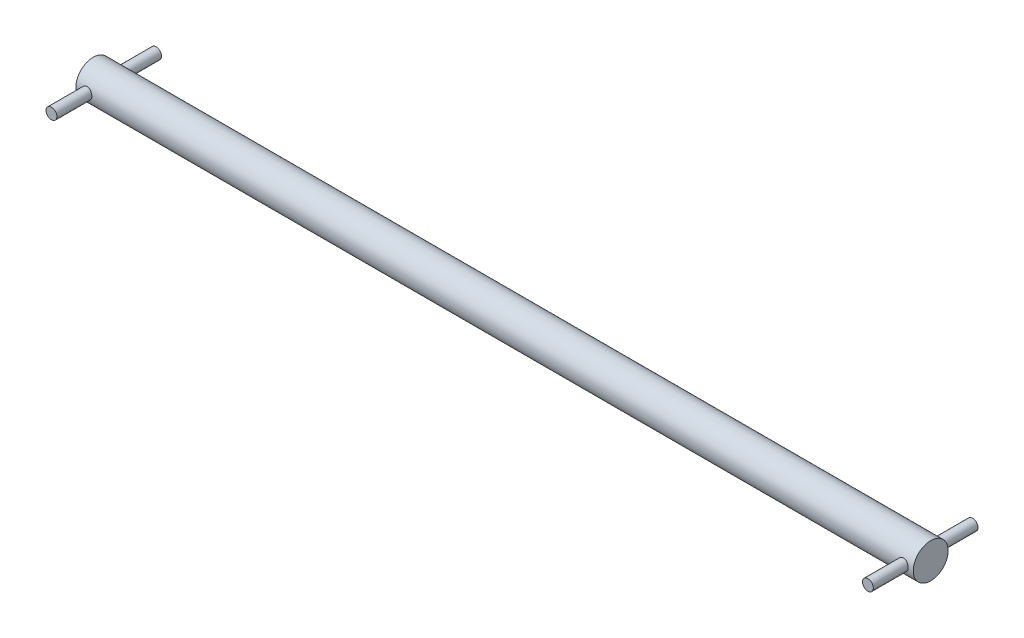
ISO-10303-21;
HEADER;
FILE_DESCRIPTION(('STEP AP214'),'2;1');
FILE_NAME('part.step','',(''),(''),'','','');
FILE_SCHEMA(('AUTOMOTIVE_DESIGN { 1 0 10303 214 1 1 1 1 }'));
ENDSEC;
DATA;
#1=APPLICATION_CONTEXT('core data for automotive mechanical design processes');
#2=APPLICATION_PROTOCOL_DEFINITION('international standard','automotive_design',2000,#1);
#3=PRODUCT_CONTEXT('',#1,'mechanical');
#4=PRODUCT('Part','Part','',(#3));
#5=PRODUCT_RELATED_PRODUCT_CATEGORY('part','',(#4));
#6=PRODUCT_DEFINITION_FORMATION('','',#4);
#7=PRODUCT_DEFINITION_CONTEXT('part definition',#1,'design');
#8=PRODUCT_DEFINITION('design','',#6,#7);
#9=PRODUCT_DEFINITION_SHAPE('','',#8);
#10=(LENGTH_UNIT() NAMED_UNIT(*) SI_UNIT(.MILLI.,.METRE.));
#11=(NAMED_UNIT(*) PLANE_ANGLE_UNIT() SI_UNIT($,.RADIAN.));
#12=(NAMED_UNIT(*) SI_UNIT($,.STERADIAN.) SOLID_ANGLE_UNIT());
#13=UNCERTAINTY_MEASURE_WITH_UNIT(LENGTH_MEASURE(1.E-05),#10,'distance_accuracy_value','');
#14=(GEOMETRIC_REPRESENTATION_CONTEXT(3) GLOBAL_UNCERTAINTY_ASSIGNED_CONTEXT((#13)) GLOBAL_UNIT_ASSIGNED_CONTEXT((#10,
#11,#12)) REPRESENTATION_CONTEXT('',''));
#15=CARTESIAN_POINT('',(0.,0.,0.));
#16=DIRECTION('',(0.,0.,1.));
#17=DIRECTION('',(1.,0.,0.));
#18=AXIS2_PLACEMENT_3D('',#15,#16,#17);
#19=CARTESIAN_POINT('',(609.6,0.,0.));
#20=DIRECTION('',(-1.,0.,0.));
#21=DIRECTION('',(0.,0.,1.));
#22=AXIS2_PLACEMENT_3D('',#19,#20,#21);
#23=CYLINDRICAL_SURFACE('',#22,12.7);
#24=CARTESIAN_POINT('',(598.01125,-5.19723153402651E-12,-12.7));
#25=CARTESIAN_POINT('',(598.011251417916,0.217294412923974,-12.6999989166263));
#26=CARTESIAN_POINT('',(598.029154545549,0.434603691691359,-12.6943705657689));
#27=CARTESIAN_POINT('',(598.100106316887,0.862867240438078,-12.67246938732));
#28=CARTESIAN_POINT('',(598.153162915832,1.07382006064949,-12.656194150346));
#29=CARTESIAN_POINT('',(598.292457753547,1.48313312608605,-12.6147771484092));
#30=CARTESIAN_POINT('',(598.378644631773,1.68151231192468,-12.5896491125947));
#31=CARTESIAN_POINT('',(598.581534983629,2.06100299744478,-12.5331210208656));
#32=CARTESIAN_POINT('',(598.698243265903,2.24211177003228,-12.501719976823));
#33=CARTESIAN_POINT('',(598.962657774655,2.58751493846823,-12.4348942862549));
#34=CARTESIAN_POINT('',(599.111136310069,2.7512010893921,-12.3993819806826));
#35=CARTESIAN_POINT('',(599.433232145913,3.05180168796217,-12.3288439723829));
#36=CARTESIAN_POINT('',(599.606854116045,3.18871115144812,-12.2938183613728));
#37=CARTESIAN_POINT('',(599.97957399009,3.43517018333352,-12.2272788441668));
#38=CARTESIAN_POINT('',(600.179195491149,3.5439598967611,-12.1958731285772));
#39=CARTESIAN_POINT('',(600.595040600067,3.72617177917924,-12.1414477071336));
#40=CARTESIAN_POINT('',(600.811259817144,3.79960326475471,-12.1184257926112));
#41=CARTESIAN_POINT('',(601.247299145911,3.90678860277264,-12.0842915217366));
#42=CARTESIAN_POINT('',(601.466814728558,3.94167074274191,-12.072841390429));
#43=CARTESIAN_POINT('',(601.90885815254,3.97429212242176,-12.0621442508114));
#44=CARTESIAN_POINT('',(602.131385177339,3.9720412366202,-12.0628939982847));
#45=CARTESIAN_POINT('',(602.56380141138,3.93134293524929,-12.0762137528444));
#46=CARTESIAN_POINT('',(602.773842474694,3.89432983731101,-12.0883153493276));
#47=CARTESIAN_POINT('',(603.184570097085,3.78748332400018,-12.1222143133619));
#48=CARTESIAN_POINT('',(603.385255659494,3.71764642055133,-12.1440127113465));
#49=CARTESIAN_POINT('',(603.774992423548,3.54612177113649,-12.1952081477578));
#50=CARTESIAN_POINT('',(603.96383083894,3.44398363976886,-12.2247115380638));
#51=CARTESIAN_POINT('',(604.322158663023,3.21106865841844,-12.2879439463374));
#52=CARTESIAN_POINT('',(604.491643028058,3.08028436905403,-12.3216740610061));
#53=CARTESIAN_POINT('',(604.814560445347,2.78675132952386,-12.39143850769));
#54=CARTESIAN_POINT('',(604.96691159595,2.62281851162716,-12.4275078349882));
#55=CARTESIAN_POINT('',(605.242223262116,2.27128199569779,-12.4965323716114));
#56=CARTESIAN_POINT('',(605.365181600271,2.08367654557779,-12.5294873501175));
#57=CARTESIAN_POINT('',(605.578950411309,1.68803513822257,-12.588916112766));
#58=CARTESIAN_POINT('',(605.669502830098,1.4798513294634,-12.6153373755817));
#59=CARTESIAN_POINT('',(605.813980777704,1.05018832945456,-12.6583425975566));
#60=CARTESIAN_POINT('',(605.867917428107,0.828713197545349,-12.6749295435738));
#61=CARTESIAN_POINT('',(605.935789785188,0.387937874391623,-12.6959166132919));
#62=CARTESIAN_POINT('',(605.951190125909,0.168884119899368,-12.7007627269302));
#63=CARTESIAN_POINT('',(605.945682230426,-0.268701220706124,-12.6990411414586));
#64=CARTESIAN_POINT('',(605.924779298251,-0.487232878428299,-12.6924751097008));
#65=CARTESIAN_POINT('',(605.848433993475,-0.91192138220343,-12.6689600496896));
#66=CARTESIAN_POINT('',(605.79386312533,-1.11825080649159,-12.6522731812639));
#67=CARTESIAN_POINT('',(605.652794431236,-1.51876737413998,-12.6104688537918));
#68=CARTESIAN_POINT('',(605.566292662221,-1.71295301443085,-12.5853503535797));
#69=CARTESIAN_POINT('',(605.361460037458,-2.0889353911893,-12.5285037326109));
#70=CARTESIAN_POINT('',(605.242404614698,-2.27031467383136,-12.49662940146));
#71=CARTESIAN_POINT('',(604.976713557877,-2.61101157680398,-12.4299157676078));
#72=CARTESIAN_POINT('',(604.830070443661,-2.77032319329469,-12.3950756621693));
#73=CARTESIAN_POINT('',(604.506478024085,-3.06891519477306,-12.3246195875385));
#74=CARTESIAN_POINT('',(604.328558092628,-3.20715171178531,-12.2890275779282));
#75=CARTESIAN_POINT('',(603.951272993004,-3.45189969528877,-12.222541820284));
#76=CARTESIAN_POINT('',(603.751908165514,-3.55841166566161,-12.1916479976326));
#77=CARTESIAN_POINT('',(603.337804076136,-3.73602515051243,-12.1383990890035));
#78=CARTESIAN_POINT('',(603.123128113042,-3.80726377090861,-12.1160110218291));
#79=CARTESIAN_POINT('',(602.683984833935,-3.91232689460458,-12.0824996743052));
#80=CARTESIAN_POINT('',(602.459521277609,-3.94616563489954,-12.0713721075623));
#81=CARTESIAN_POINT('',(602.018087021932,-3.9744461455257,-12.0620882936639));
#82=CARTESIAN_POINT('',(601.801236534034,-3.97060037799214,-12.0633681960528));
#83=CARTESIAN_POINT('',(601.371433192809,-3.92775497559569,-12.0773853694332));
#84=CARTESIAN_POINT('',(601.158480158135,-3.88875698061999,-12.0901221059517));
#85=CARTESIAN_POINT('',(600.745578924296,-3.77786042476261,-12.125223850321));
#86=CARTESIAN_POINT('',(600.545485974529,-3.70645189639602,-12.147445167539));
#87=CARTESIAN_POINT('',(600.15996168703,-3.53314721789152,-12.1989756100809));
#88=CARTESIAN_POINT('',(599.974533341401,-3.43124486610984,-12.2282861769393));
#89=CARTESIAN_POINT('',(599.615749043854,-3.19518268168379,-12.2921232133123));
#90=CARTESIAN_POINT('',(599.443149188837,-3.05991683939661,-12.3268088783025));
#91=CARTESIAN_POINT('',(599.122543408245,-2.76291356359071,-12.3967557125722));
#92=CARTESIAN_POINT('',(598.974544082454,-2.60116904944893,-12.4320170335101));
#93=CARTESIAN_POINT('',(598.702502940698,-2.24944515446967,-12.50052338449));
#94=CARTESIAN_POINT('',(598.579401211772,-2.05871627400301,-12.5336649799479));
#95=CARTESIAN_POINT('',(598.367170944432,-1.65823626319892,-12.5928999251751));
#96=CARTESIAN_POINT('',(598.2780290507,-1.44849265100611,-12.6189960445267));
#97=CARTESIAN_POINT('',(598.142722407843,-1.03424874231788,-12.6593806607872));
#98=CARTESIAN_POINT('',(598.093562296306,-0.830803320337787,-12.6744806455946));
#99=CARTESIAN_POINT('',(598.027828707102,-0.418242418028124,-12.6947898358102));
#100=CARTESIAN_POINT('',(598.011248635372,-0.209128093748738,-12.7000010426586));
#101=CARTESIAN_POINT('',(598.01125,-5.19723153402651E-12,-12.7));
#102=B_SPLINE_CURVE_WITH_KNOTS('',3,(#24,#25,#26,#27,#28,#29,#30,#31,#32,#33,#34,#35,#36,#37,
#38,#39,#40,#41,#42,#43,#44,#45,#46,#47,#48,#49,#50,#51,#52,#53,#54,#55,#56,#57,#58,#59,#60,#61,
#62,#63,#64,#65,#66,#67,#68,#69,#70,#71,#72,#73,#74,#75,#76,#77,#78,#79,#80,#81,#82,#83,#84,#85,
#86,#87,#88,#89,#90,#91,#92,#93,#94,#95,#96,#97,#98,#99,#100,#101),.UNSPECIFIED.,.T.,.F.,(4,2,2,
2,2,2,2,2,2,2,2,2,2,2,2,2,2,2,2,2,2,2,2,2,2,2,2,2,2,2,2,2,2,2,2,2,2,2,4),(0.,0.651114551948165,
1.3023765016332,1.95263287146765,2.60299175094775,3.27145085469602,3.94003426594265,
4.6251422371075,5.3100695893746,5.97437051780854,6.63849479687025,7.27636712817865,
7.91430725938272,8.56156665642483,9.20899434587629,9.88589422617475,10.5628442354198,
11.2450708769476,11.9270902077494,12.5827653014538,13.2383446069144,13.8776273984984,
14.5169891598925,15.1719383104896,15.8270653013163,16.5081514741896,17.1892268287804,
17.8676336752166,18.545782183788,19.1932624606431,19.8407125334475,20.4786837506947,
21.1167848028334,21.7798495700523,22.4430919369538,23.1279912133639,23.8126208620066,
24.439392214037,25.0660366970775),.UNSPECIFIED.);
#103=CARTESIAN_POINT('',(598.01125,-5.19723153402651E-12,-12.7));
#104=VERTEX_POINT('',#103);
#105=EDGE_CURVE('E43',#104,#104,#102,.T.);
#106=ORIENTED_EDGE('',*,*,#105,.F.);
#107=EDGE_LOOP('',(#106));
#108=FACE_BOUND('',#107,.T.);
#109=CARTESIAN_POINT('',(3.65125,0.,-12.7));
#110=CARTESIAN_POINT('',(3.65125141791555,0.217294412929186,-12.6999989166262));
#111=CARTESIAN_POINT('',(3.66915454554863,0.43460369169658,-12.6943705657687));
#112=CARTESIAN_POINT('',(3.74010631688707,0.862867240443327,-12.6724693873196));
#113=CARTESIAN_POINT('',(3.79316291583183,1.07382006065476,-12.6561941503455));
#114=CARTESIAN_POINT('',(3.93245775354646,1.48313312609132,-12.6147771484086));
#115=CARTESIAN_POINT('',(4.01864463177317,1.68151231192993,-12.589649112594));
#116=CARTESIAN_POINT('',(4.22153498362869,2.06100299745002,-12.5331210208647));
#117=CARTESIAN_POINT('',(4.33824326590336,2.24211177003752,-12.5017199768221));
#118=CARTESIAN_POINT('',(4.60265777465513,2.5875149384735,-12.4348942862538));
#119=CARTESIAN_POINT('',(4.75113631006893,2.75120108939739,-12.3993819806815));
#120=CARTESIAN_POINT('',(5.073232145913,3.05180168796748,-12.3288439723816));
#121=CARTESIAN_POINT('',(5.24685411604509,3.18871115145342,-12.2938183613714));
#122=CARTESIAN_POINT('',(5.61957399009077,3.43517018333881,-12.2272788441653));
#123=CARTESIAN_POINT('',(5.81919549114932,3.5439598967664,-12.1958731285757));
#124=CARTESIAN_POINT('',(6.23504060006707,3.72617177918452,-12.141447707132));
#125=CARTESIAN_POINT('',(6.4512598171443,3.79960326475997,-12.1184257926096));
#126=CARTESIAN_POINT('',(6.88729914591169,3.90678860277786,-12.0842915217349));
#127=CARTESIAN_POINT('',(7.10681472855847,3.94167074274713,-12.0728413904273));
#128=CARTESIAN_POINT('',(7.54885815254015,3.97429212242696,-12.0621442508097));
#129=CARTESIAN_POINT('',(7.77138517733972,3.97204123662538,-12.062893998283));
#130=CARTESIAN_POINT('',(8.20380141138065,3.93134293525445,-12.0762137528427));
#131=CARTESIAN_POINT('',(8.41384247469401,3.89432983731616,-12.0883153493259));
#132=CARTESIAN_POINT('',(8.8245700970855,3.78748332400533,-12.1222143133603));
#133=CARTESIAN_POINT('',(9.02525565949387,3.7176464205565,-12.144012711345));
#134=CARTESIAN_POINT('',(9.414992423548,3.5461217711417,-12.1952081477563));
#135=CARTESIAN_POINT('',(9.60383083894017,3.44398363977409,-12.2247115380623));
#136=CARTESIAN_POINT('',(9.96215866302309,3.21106865842369,-12.287943946336));
#137=CARTESIAN_POINT('',(10.1316430280574,3.08028436905927,-12.3216740610048));
#138=CARTESIAN_POINT('',(10.454560445347,2.7867513295291,-12.3914385076889));
#139=CARTESIAN_POINT('',(10.60691159595,2.62281851163243,-12.4275078349871));
#140=CARTESIAN_POINT('',(10.882223262116,2.27128199570308,-12.4965323716105));
#141=CARTESIAN_POINT('',(11.0051816002711,2.08367654558308,-12.5294873501166));
#142=CARTESIAN_POINT('',(11.2189504113089,1.68803513822788,-12.5889161127653));
#143=CARTESIAN_POINT('',(11.3095028300981,1.47985132946873,-12.615337375581));
#144=CARTESIAN_POINT('',(11.4539807777038,1.05018832945987,-12.6583425975561));
#145=CARTESIAN_POINT('',(11.5079174281069,0.828713197550621,-12.6749295435735));
#146=CARTESIAN_POINT('',(11.5757897851883,0.387937874396843,-12.6959166132918));
#147=CARTESIAN_POINT('',(11.5911901259094,0.168884119904572,-12.7007627269301));
#148=CARTESIAN_POINT('',(11.5856822304265,-0.268701220700966,-12.6990411414587));
#149=CARTESIAN_POINT('',(11.5647792982507,-0.48723287842317,-12.692475109701));
#150=CARTESIAN_POINT('',(11.4884339934747,-0.911921382198323,-12.6689600496899));
#151=CARTESIAN_POINT('',(11.4338631253304,-1.11825080648648,-12.6522731812643));
#152=CARTESIAN_POINT('',(11.2927944312357,-1.51876737413487,-12.6104688537924));
#153=CARTESIAN_POINT('',(11.2062926622206,-1.71295301442576,-12.5853503535804));
#154=CARTESIAN_POINT('',(11.0014600374579,-2.0889353911842,-12.5285037326117));
#155=CARTESIAN_POINT('',(10.8824046146976,-2.27031467382624,-12.4966294014609));
#156=CARTESIAN_POINT('',(10.6167135578772,-2.61101157679882,-12.4299157676089));
#157=CARTESIAN_POINT('',(10.4700704436608,-2.77032319328954,-12.3950756621704));
#158=CARTESIAN_POINT('',(10.1464780240846,-3.06891519476788,-12.3246195875397));
#159=CARTESIAN_POINT('',(9.96855809262797,-3.20715171178012,-12.2890275779295));
#160=CARTESIAN_POINT('',(9.59127299300375,-3.45189969528356,-12.2225418202855));
#161=CARTESIAN_POINT('',(9.39190816551433,-3.55841166565639,-12.1916479976341));
#162=CARTESIAN_POINT('',(8.97780407613624,-3.73602515050722,-12.1383990890051));
#163=CARTESIAN_POINT('',(8.76312811304158,-3.8072637709034,-12.1160110218308));
#164=CARTESIAN_POINT('',(8.32398483393563,-3.91232689459937,-12.0824996743068));
#165=CARTESIAN_POINT('',(8.09952127760928,-3.94616563489433,-12.071372107564));
#166=CARTESIAN_POINT('',(7.65808702193213,-3.97444614552049,-12.0620882936656));
#167=CARTESIAN_POINT('',(7.44123653403444,-3.97060037798694,-12.0633681960545));
#168=CARTESIAN_POINT('',(7.01143319280933,-3.92775497559048,-12.0773853694349));
#169=CARTESIAN_POINT('',(6.7984801581346,-3.88875698061476,-12.0901221059534));
#170=CARTESIAN_POINT('',(6.38557892429573,-3.77786042475736,-12.1252238503226));
#171=CARTESIAN_POINT('',(6.18548597452857,-3.70645189639076,-12.1474451675407));
#172=CARTESIAN_POINT('',(5.79996168702952,-3.53314721788623,-12.1989756100824));
#173=CARTESIAN_POINT('',(5.61453334140106,-3.43124486610452,-12.2282861769408));
#174=CARTESIAN_POINT('',(5.25574904385359,-3.19518268167841,-12.2921232133137));
#175=CARTESIAN_POINT('',(5.08314918883673,-3.0599168393912,-12.3268088783039));
#176=CARTESIAN_POINT('',(4.7625434082444,-2.76291356358524,-12.3967557125734));
#177=CARTESIAN_POINT('',(4.61454408245338,-2.60116904944344,-12.4320170335113));
#178=CARTESIAN_POINT('',(4.34250294069769,-2.24944515446413,-12.500523384491));
#179=CARTESIAN_POINT('',(4.2194012117714,-2.05871627399745,-12.5336649799489));
#180=CARTESIAN_POINT('',(4.00717094443223,-1.65823626319335,-12.5928999251759));
#181=CARTESIAN_POINT('',(3.91802905069967,-1.44849265100056,-12.6189960445273));
#182=CARTESIAN_POINT('',(3.78272240784313,-1.03424874231239,-12.6593806607877));
#183=CARTESIAN_POINT('',(3.73356229630555,-0.830803320332339,-12.674480645595));
#184=CARTESIAN_POINT('',(3.6678287071025,-0.418242418022788,-12.6947898358104));
#185=CARTESIAN_POINT('',(3.65124863537229,-0.209128093743468,-12.7000010426587));
#186=CARTESIAN_POINT('',(3.65125,0.,-12.7));
#187=B_SPLINE_CURVE_WITH_KNOTS('',3,(#109,#110,#111,#112,#113,#114,#115,#116,#117,#118,#119,
#120,#121,#122,#123,#124,#125,#126,#127,#128,#129,#130,#131,#132,#133,#134,#135,#136,#137,#138,
#139,#140,#141,#142,#143,#144,#145,#146,#147,#148,#149,#150,#151,#152,#153,#154,#155,#156,#157,
#158,#159,#160,#161,#162,#163,#164,#165,#166,#167,#168,#169,#170,#171,#172,#173,#174,#175,#176,
#177,#178,#179,#180,#181,#182,#183,#184,#185,#186),.UNSPECIFIED.,.T.,.F.,(4,2,2,2,2,2,2,2,2,2,2,
2,2,2,2,2,2,2,2,2,2,2,2,2,2,2,2,2,2,2,2,2,2,2,2,2,2,2,4),(0.,0.651114551948222,1.30237650163329,
1.95263287146774,2.6029917509479,3.27145085469629,3.94003426594303,4.62514223710794,
5.31006958937499,5.97437051780892,6.63849479687064,7.27636712817897,7.91430725938283,
8.56156665642489,9.20899434587646,9.88589422617489,10.56284423542,11.2450708769478,
11.9270902077497,12.5827653014541,13.2383446069149,13.8776273984988,14.516989159893,
15.17193831049,15.8270653013166,16.5081514741898,17.1892268287805,17.8676336752166,
18.5457821837881,19.1932624606433,19.8407125334477,20.4786837506951,21.1167848028338,
21.7798495700527,22.4430919369543,23.1279912133643,23.8126208620069,24.4393922140372,
25.0660366970775),.UNSPECIFIED.);
#188=CARTESIAN_POINT('',(3.65125,0.,-12.7));
#189=VERTEX_POINT('',#188);
#190=EDGE_CURVE('E51',#189,#189,#187,.T.);
#191=ORIENTED_EDGE('',*,*,#190,.F.);
#192=EDGE_LOOP('',(#191));
#193=FACE_BOUND('',#192,.T.);
#194=CARTESIAN_POINT('',(609.6,0.,0.));
#195=DIRECTION('',(1.,0.,0.));
#196=DIRECTION('',(0.,0.,-1.));
#197=AXIS2_PLACEMENT_3D('',#194,#195,#196);
#198=CIRCLE('',#197,12.7);
#199=CARTESIAN_POINT('',(609.6,0.,-12.7));
#200=VERTEX_POINT('',#199);
#201=EDGE_CURVE('E90',#200,#200,#198,.T.);
#202=ORIENTED_EDGE('',*,*,#201,.F.);
#203=EDGE_LOOP('',(#202));
#204=FACE_BOUND('',#203,.T.);
#205=CARTESIAN_POINT('',(0.,0.,0.));
#206=DIRECTION('',(1.,0.,0.));
#207=DIRECTION('',(0.,0.,-1.));
#208=AXIS2_PLACEMENT_3D('',#205,#206,#207);
#209=CIRCLE('',#208,12.7);
#210=CARTESIAN_POINT('',(0.,0.,-12.7));
#211=VERTEX_POINT('',#210);
#212=EDGE_CURVE('E91',#211,#211,#209,.T.);
#213=ORIENTED_EDGE('',*,*,#212,.T.);
#214=EDGE_LOOP('',(#213));
#215=FACE_BOUND('',#214,.T.);
#216=CARTESIAN_POINT('',(11.58875,0.,12.7));
#217=CARTESIAN_POINT('',(11.5887485820844,0.217294412929186,12.6999989166262));
#218=CARTESIAN_POINT('',(11.5708454544514,0.43460369169658,12.6943705657687));
#219=CARTESIAN_POINT('',(11.4998936831129,0.862867240443325,12.6724693873196));
#220=CARTESIAN_POINT('',(11.4468370841682,1.07382006065475,12.6561941503455));
#221=CARTESIAN_POINT('',(11.3075422464535,1.48313312609131,12.6147771484086));
#222=CARTESIAN_POINT('',(11.2213553682268,1.68151231192992,12.589649112594));
#223=CARTESIAN_POINT('',(11.0184650163713,2.06100299745001,12.5331210208647));
#224=CARTESIAN_POINT('',(10.9017567340967,2.24211177003751,12.5017199768221));
#225=CARTESIAN_POINT('',(10.6373422253449,2.58751493847348,12.4348942862539));
#226=CARTESIAN_POINT('',(10.4888636899311,2.75120108939738,12.3993819806815));
#227=CARTESIAN_POINT('',(10.166767854087,3.05180168796746,12.3288439723816));
#228=CARTESIAN_POINT('',(9.99314588395492,3.18871115145341,12.2938183613714));
#229=CARTESIAN_POINT('',(9.62042600990924,3.4351701833388,12.2272788441653));
#230=CARTESIAN_POINT('',(9.4208045088507,3.5439598967664,12.1958731285757));
#231=CARTESIAN_POINT('',(9.00495939993294,3.72617177918452,12.141447707132));
#232=CARTESIAN_POINT('',(8.78874018285571,3.79960326475997,12.1184257926096));
#233=CARTESIAN_POINT('',(8.35270085408832,3.90678860277786,12.0842915217349));
#234=CARTESIAN_POINT('',(8.13318527144153,3.94167074274713,12.0728413904273));
#235=CARTESIAN_POINT('',(7.69114184745985,3.97429212242696,12.0621442508097));
#236=CARTESIAN_POINT('',(7.46861482266027,3.97204123662538,12.062893998283));
#237=CARTESIAN_POINT('',(7.03619858861934,3.93134293525445,12.0762137528427));
#238=CARTESIAN_POINT('',(6.82615752530598,3.89432983731616,12.0883153493259));
#239=CARTESIAN_POINT('',(6.41542990291449,3.78748332400533,12.1222143133603));
#240=CARTESIAN_POINT('',(6.21474434050612,3.71764642055649,12.144012711345));
#241=CARTESIAN_POINT('',(5.82500757645199,3.5461217711417,12.1952081477563));
#242=CARTESIAN_POINT('',(5.63616916105982,3.44398363977409,12.2247115380623));
#243=CARTESIAN_POINT('',(5.2778413369769,3.21106865842369,12.287943946336));
#244=CARTESIAN_POINT('',(5.10835697194258,3.08028436905926,12.3216740610048));
#245=CARTESIAN_POINT('',(4.78543955465303,2.7867513295291,12.3914385076889));
#246=CARTESIAN_POINT('',(4.63308840405003,2.62281851163243,12.4275078349871));
#247=CARTESIAN_POINT('',(4.35777673788399,2.27128199570309,12.4965323716104));
#248=CARTESIAN_POINT('',(4.23481839972887,2.08367654558309,12.5294873501166));
#249=CARTESIAN_POINT('',(4.02104958869109,1.68803513822789,12.5889161127653));
#250=CARTESIAN_POINT('',(3.93049716990193,1.47985132946874,12.615337375581));
#251=CARTESIAN_POINT('',(3.78601922229624,1.05018832945989,12.6583425975561));
#252=CARTESIAN_POINT('',(3.73208257189308,0.828713197550637,12.6749295435735));
#253=CARTESIAN_POINT('',(3.66421021481174,0.38793787439686,12.6959166132918));
#254=CARTESIAN_POINT('',(3.64880987409056,0.168884119904588,12.7007627269301));
#255=CARTESIAN_POINT('',(3.65431776957352,-0.268701220700952,12.6990411414587));
#256=CARTESIAN_POINT('',(3.67522070174928,-0.487232878423158,12.692475109701));
#257=CARTESIAN_POINT('',(3.75156600652527,-0.911921382198314,12.6689600496899));
#258=CARTESIAN_POINT('',(3.80613687466964,-1.11825080648647,12.6522731812643));
#259=CARTESIAN_POINT('',(3.94720556876432,-1.51876737413487,12.6104688537924));
#260=CARTESIAN_POINT('',(4.03370733777941,-1.71295301442576,12.5853503535804));
#261=CARTESIAN_POINT('',(4.23853996254207,-2.0889353911842,12.5285037326117));
#262=CARTESIAN_POINT('',(4.35759538530237,-2.27031467382624,12.4966294014609));
#263=CARTESIAN_POINT('',(4.62328644212282,-2.61101157679883,12.4299157676089));
#264=CARTESIAN_POINT('',(4.76992955633923,-2.77032319328954,12.3950756621704));
#265=CARTESIAN_POINT('',(5.09352197591541,-3.06891519476789,12.3246195875397));
#266=CARTESIAN_POINT('',(5.27144190737203,-3.20715171178012,12.2890275779295));
#267=CARTESIAN_POINT('',(5.64872700699625,-3.45189969528356,12.2225418202855));
#268=CARTESIAN_POINT('',(5.84809183448567,-3.55841166565639,12.1916479976341));
#269=CARTESIAN_POINT('',(6.26219592386376,-3.73602515050722,12.1383990890051));
#270=CARTESIAN_POINT('',(6.47687188695841,-3.8072637709034,12.1160110218308));
#271=CARTESIAN_POINT('',(6.91601516606436,-3.91232689459937,12.0824996743068));
#272=CARTESIAN_POINT('',(7.14047872239071,-3.94616563489433,12.071372107564));
#273=CARTESIAN_POINT('',(7.58191297806784,-3.97444614552049,12.0620882936656));
#274=CARTESIAN_POINT('',(7.79876346596554,-3.97060037798694,12.0633681960545));
#275=CARTESIAN_POINT('',(8.22856680719064,-3.92775497559048,12.0773853694349));
#276=CARTESIAN_POINT('',(8.44151984186537,-3.88875698061477,12.0901221059534));
#277=CARTESIAN_POINT('',(8.85442107570424,-3.77786042475737,12.1252238503226));
#278=CARTESIAN_POINT('',(9.05451402547141,-3.70645189639077,12.1474451675406));
#279=CARTESIAN_POINT('',(9.44003831297045,-3.53314721788625,12.1989756100824));
#280=CARTESIAN_POINT('',(9.62546665859892,-3.43124486610453,12.2282861769408));
#281=CARTESIAN_POINT('',(9.9842509561464,-3.19518268167842,12.2921232133137));
#282=CARTESIAN_POINT('',(10.1568508111633,-3.05991683939121,12.3268088783039));
#283=CARTESIAN_POINT('',(10.4774565917556,-2.76291356358525,12.3967557125734));
#284=CARTESIAN_POINT('',(10.6254559175466,-2.60116904944344,12.4320170335113));
#285=CARTESIAN_POINT('',(10.8974970593023,-2.24944515446413,12.500523384491));
#286=CARTESIAN_POINT('',(11.0205987882286,-2.05871627399745,12.5336649799489));
#287=CARTESIAN_POINT('',(11.2328290555678,-1.65823626319334,12.5928999251759));
#288=CARTESIAN_POINT('',(11.3219709493003,-1.44849265100055,12.6189960445274));
#289=CARTESIAN_POINT('',(11.4572775921569,-1.03424874231238,12.6593806607877));
#290=CARTESIAN_POINT('',(11.5064377036945,-0.830803320332336,12.674480645595));
#291=CARTESIAN_POINT('',(11.5721712928975,-0.418242418022788,12.6947898358104));
#292=CARTESIAN_POINT('',(11.5887513646277,-0.209128093743468,12.7000010426587));
#293=CARTESIAN_POINT('',(11.58875,0.,12.7));
#294=B_SPLINE_CURVE_WITH_KNOTS('',3,(#216,#217,#218,#219,#220,#221,#222,#223,#224,#225,#226,
#227,#228,#229,#230,#231,#232,#233,#234,#235,#236,#237,#238,#239,#240,#241,#242,#243,#244,#245,
#246,#247,#248,#249,#250,#251,#252,#253,#254,#255,#256,#257,#258,#259,#260,#261,#262,#263,#264,
#265,#266,#267,#268,#269,#270,#271,#272,#273,#274,#275,#276,#277,#278,#279,#280,#281,#282,#283,
#284,#285,#286,#287,#288,#289,#290,#291,#292,#293),.UNSPECIFIED.,.T.,.F.,(4,2,2,2,2,2,2,2,2,2,2,
2,2,2,2,2,2,2,2,2,2,2,2,2,2,2,2,2,2,2,2,2,2,2,2,2,2,2,4),(0.,0.651114551948219,1.30237650163328,
1.95263287146773,2.60299175094788,3.27145085469627,3.94003426594301,4.62514223710793,
5.31006958937498,5.97437051780891,6.63849479687065,7.27636712817898,7.91430725938283,
8.56156665642489,9.20899434587646,9.88589422617488,10.5628442354199,11.2450708769478,
11.9270902077497,12.5827653014541,13.2383446069148,13.8776273984988,14.5169891598929,
15.17193831049,15.8270653013166,16.5081514741898,17.1892268287804,17.8676336752166,
18.5457821837881,19.1932624606433,19.8407125334476,20.478683750695,21.1167848028337,
21.7798495700527,22.4430919369543,23.1279912133643,23.8126208620069,24.4393922140372,
25.0660366970775),.UNSPECIFIED.);
#295=CARTESIAN_POINT('',(11.58875,0.,12.7));
#296=VERTEX_POINT('',#295);
#297=EDGE_CURVE('E47',#296,#296,#294,.T.);
#298=ORIENTED_EDGE('',*,*,#297,.F.);
#299=EDGE_LOOP('',(#298));
#300=FACE_BOUND('',#299,.T.);
#301=CARTESIAN_POINT('',(605.94875,0.,12.7));
#302=CARTESIAN_POINT('',(605.948748582084,0.217294412929195,12.6999989166262));
#303=CARTESIAN_POINT('',(605.930845454451,0.434603691696574,12.6943705657687));
#304=CARTESIAN_POINT('',(605.859893683112,0.862867240443248,12.6724693873196));
#305=CARTESIAN_POINT('',(605.806837084167,1.07382006065462,12.6561941503456));
#306=CARTESIAN_POINT('',(605.667542246452,1.48313312609101,12.6147771484086));
#307=CARTESIAN_POINT('',(605.581355368225,1.68151231192952,12.5896491125941));
#308=CARTESIAN_POINT('',(605.378465016369,2.06100299744937,12.5331210208648));
#309=CARTESIAN_POINT('',(605.261756734094,2.24211177003673,12.5017199768222));
#310=CARTESIAN_POINT('',(604.997342225341,2.58751493847236,12.4348942862541));
#311=CARTESIAN_POINT('',(604.848863689927,2.75120108939605,12.3993819806817));
#312=CARTESIAN_POINT('',(604.526767854083,3.05180168796575,12.328843972382));
#313=CARTESIAN_POINT('',(604.353145883951,3.1887111514515,12.2938183613719));
#314=CARTESIAN_POINT('',(603.980426009904,3.43517018333639,12.227278844166));
#315=CARTESIAN_POINT('',(603.780804508846,3.54395989676369,12.1958731285765));
#316=CARTESIAN_POINT('',(603.364959399928,3.72617177918122,12.141447707133));
#317=CARTESIAN_POINT('',(603.14874018285,3.79960326475637,12.1184257926107));
#318=CARTESIAN_POINT('',(602.712700854083,3.90678860277367,12.0842915217363));
#319=CARTESIAN_POINT('',(602.493185271436,3.94167074274263,12.0728413904288));
#320=CARTESIAN_POINT('',(602.051141847454,3.97429212242186,12.0621442508114));
#321=CARTESIAN_POINT('',(601.828614822655,3.97204123661998,12.0628939982848));
#322=CARTESIAN_POINT('',(601.396198588614,3.93134293524849,12.0762137528446));
#323=CARTESIAN_POINT('',(601.186157525301,3.89432983730991,12.0883153493279));
#324=CARTESIAN_POINT('',(600.775429902909,3.78748332399852,12.1222143133624));
#325=CARTESIAN_POINT('',(600.574744340501,3.71764642054942,12.1440127113471));
#326=CARTESIAN_POINT('',(600.185007576447,3.54612177113406,12.1952081477585));
#327=CARTESIAN_POINT('',(599.996169161055,3.44398363976615,12.2247115380646));
#328=CARTESIAN_POINT('',(599.637841336972,3.21106865841518,12.2879439463383));
#329=CARTESIAN_POINT('',(599.468356971938,3.08028436905048,12.321674061007));
#330=CARTESIAN_POINT('',(599.145439554649,2.78675132951979,12.391438507691));
#331=CARTESIAN_POINT('',(598.993088404046,2.62281851162287,12.4275078349891));
#332=CARTESIAN_POINT('',(598.717776737881,2.27128199569307,12.4965323716123));
#333=CARTESIAN_POINT('',(598.594818399726,2.08367654557286,12.5294873501184));
#334=CARTESIAN_POINT('',(598.381049588688,1.68803513821737,12.5889161127667));
#335=CARTESIAN_POINT('',(598.2904971699,1.47985132945813,12.6153373755823));
#336=CARTESIAN_POINT('',(598.146019222295,1.05018832944914,12.658342597557));
#337=CARTESIAN_POINT('',(598.092082571892,0.828713197539842,12.6749295435742));
#338=CARTESIAN_POINT('',(598.024210214811,0.387937874386056,12.6959166132921));
#339=CARTESIAN_POINT('',(598.00880987409,0.168884119893823,12.7007627269303));
#340=CARTESIAN_POINT('',(598.014317769574,-0.268701220711579,12.6990411414585));
#341=CARTESIAN_POINT('',(598.03522070175,-0.487232878433687,12.6924751097006));
#342=CARTESIAN_POINT('',(598.111566006526,-0.911921382208675,12.6689600496892));
#343=CARTESIAN_POINT('',(598.166136874671,-1.11825080649676,12.6522731812634));
#344=CARTESIAN_POINT('',(598.307205568766,-1.51876737414494,12.6104688537912));
#345=CARTESIAN_POINT('',(598.393707337782,-1.71295301443568,12.5853503535791));
#346=CARTESIAN_POINT('',(598.598539962545,-2.08893539119386,12.5285037326101));
#347=CARTESIAN_POINT('',(598.717595385305,-2.27031467383579,12.4966294014592));
#348=CARTESIAN_POINT('',(598.983286442126,-2.61101157680809,12.4299157676069));
#349=CARTESIAN_POINT('',(599.129929556343,-2.77032319329862,12.3950756621684));
#350=CARTESIAN_POINT('',(599.45352197592,-3.06891519477657,12.3246195875376));
#351=CARTESIAN_POINT('',(599.631441907376,-3.2071517117886,12.2890275779273));
#352=CARTESIAN_POINT('',(600.008727007001,-3.45189969529159,12.2225418202832));
#353=CARTESIAN_POINT('',(600.208091834491,-3.55841166566417,12.1916479976318));
#354=CARTESIAN_POINT('',(600.622195923869,-3.7360251505144,12.1383990890029));
#355=CARTESIAN_POINT('',(600.836871886964,-3.80726377091027,12.1160110218286));
#356=CARTESIAN_POINT('',(601.27601516607,-3.91232689460558,12.0824996743048));
#357=CARTESIAN_POINT('',(601.500478722396,-3.94616563490021,12.0713721075621));
#358=CARTESIAN_POINT('',(601.941912978073,-3.97444614552574,12.0620882936638));
#359=CARTESIAN_POINT('',(602.158763465971,-3.97060037799189,12.0633681960529));
#360=CARTESIAN_POINT('',(602.588566807196,-3.92775497559488,12.0773853694335));
#361=CARTESIAN_POINT('',(602.80151984187,-3.8887569806189,12.0901221059521));
#362=CARTESIAN_POINT('',(603.214421075709,-3.77786042476097,12.1252238503215));
#363=CARTESIAN_POINT('',(603.414514025476,-3.70645189639411,12.1474451675396));
#364=CARTESIAN_POINT('',(603.800038312975,-3.53314721788909,12.1989756100816));
#365=CARTESIAN_POINT('',(603.985466658603,-3.43124486610712,12.2282861769401));
#366=CARTESIAN_POINT('',(604.344250956151,-3.19518268168053,12.2921232133132));
#367=CARTESIAN_POINT('',(604.516850811167,-3.05991683939309,12.3268088783034));
#368=CARTESIAN_POINT('',(604.837456591759,-2.76291356358669,12.3967557125731));
#369=CARTESIAN_POINT('',(604.98545591755,-2.60116904944468,12.432017033511));
#370=CARTESIAN_POINT('',(605.257497059305,-2.24944515446498,12.5005233844909));
#371=CARTESIAN_POINT('',(605.380598788231,-2.05871627399812,12.5336649799488));
#372=CARTESIAN_POINT('',(605.59282905557,-1.6582362631937,12.5928999251758));
#373=CARTESIAN_POINT('',(605.681970949302,-1.44849265100076,12.6189960445273));
#374=CARTESIAN_POINT('',(605.817277592158,-1.03424874231242,12.6593806607877));
#375=CARTESIAN_POINT('',(605.866437703696,-0.830803320332341,12.674480645595));
#376=CARTESIAN_POINT('',(605.932171292898,-0.418242418022763,12.6947898358104));
#377=CARTESIAN_POINT('',(605.948751364628,-0.209128093743445,12.7000010426587));
#378=CARTESIAN_POINT('',(605.94875,0.,12.7));
#379=B_SPLINE_CURVE_WITH_KNOTS('',3,(#301,#302,#303,#304,#305,#306,#307,#308,#309,#310,#311,
#312,#313,#314,#315,#316,#317,#318,#319,#320,#321,#322,#323,#324,#325,#326,#327,#328,#329,#330,
#331,#332,#333,#334,#335,#336,#337,#338,#339,#340,#341,#342,#343,#344,#345,#346,#347,#348,#349,
#350,#351,#352,#353,#354,#355,#356,#357,#358,#359,#360,#361,#362,#363,#364,#365,#366,#367,#368,
#369,#370,#371,#372,#373,#374,#375,#376,#377,#378),.UNSPECIFIED.,.T.,.F.,(4,2,2,2,2,2,2,2,2,2,2,
2,2,2,2,2,2,2,2,2,2,2,2,2,2,2,2,2,2,2,2,2,2,2,2,2,2,2,4),(0.,0.651114551948238,1.30237650163335,
1.95263287146781,2.60299175094799,3.2714508546964,3.94003426594326,4.62514223710806,
5.31006958937505,5.97437051780893,6.63849479687054,7.276367128179,7.91430725938293,
8.56156665642515,9.20899434587689,9.88589422617539,10.5628442354204,11.2450708769481,
11.9270902077498,12.5827653014541,13.2383446069146,13.8776273984986,14.5169891598928,
15.1719383104899,15.8270653013167,16.50815147419,17.189226828781,17.8676336752171,
18.5457821837884,19.1932624606433,19.8407125334476,20.4786837506949,21.1167848028337,
21.7798495700528,22.4430919369544,23.1279912133645,23.8126208620072,24.4393922140373,
25.0660366970776),.UNSPECIFIED.);
#380=CARTESIAN_POINT('',(605.94875,0.,12.7));
#381=VERTEX_POINT('',#380);
#382=EDGE_CURVE('E10',#381,#381,#379,.T.);
#383=ORIENTED_EDGE('',*,*,#382,.F.);
#384=EDGE_LOOP('',(#383));
#385=FACE_BOUND('',#384,.T.);
#386=ADVANCED_FACE('F33',(#108,#193,#204,#215,#300,#385),#23,.T.);
#387=CARTESIAN_POINT('',(609.6,0.,0.));
#388=DIRECTION('',(1.,0.,0.));
#389=DIRECTION('',(0.,0.,-1.));
#390=AXIS2_PLACEMENT_3D('',#387,#388,#389);
#391=PLANE('',#390);
#392=ORIENTED_EDGE('',*,*,#201,.T.);
#393=EDGE_LOOP('',(#392));
#394=FACE_BOUND('',#393,.T.);
#395=ADVANCED_FACE('F84',(#394),#391,.T.);
#396=CARTESIAN_POINT('',(0.,0.,0.));
#397=DIRECTION('',(1.,0.,0.));
#398=DIRECTION('',(0.,0.,-1.));
#399=AXIS2_PLACEMENT_3D('',#396,#397,#398);
#400=PLANE('',#399);
#401=ORIENTED_EDGE('',*,*,#212,.F.);
#402=EDGE_LOOP('',(#401));
#403=FACE_BOUND('',#402,.T.);
#404=ADVANCED_FACE('F78',(#403),#400,.F.);
#405=CARTESIAN_POINT('',(7.62,0.,-38.1));
#406=DIRECTION('',(0.,0.,1.));
#407=DIRECTION('',(1.,0.,0.));
#408=AXIS2_PLACEMENT_3D('',#405,#406,#407);
#409=PLANE('',#408);
#410=CARTESIAN_POINT('',(7.62,0.,-38.1));
#411=DIRECTION('',(0.,0.,1.));
#412=DIRECTION('',(1.,0.,0.));
#413=AXIS2_PLACEMENT_3D('',#410,#411,#412);
#414=CIRCLE('',#413,3.96875);
#415=CARTESIAN_POINT('',(11.58875,0.,-38.1));
#416=VERTEX_POINT('',#415);
#417=EDGE_CURVE('E99',#416,#416,#414,.T.);
#418=ORIENTED_EDGE('',*,*,#417,.F.);
#419=EDGE_LOOP('',(#418));
#420=FACE_BOUND('',#419,.T.);
#421=ADVANCED_FACE('F75',(#420),#409,.F.);
#422=CARTESIAN_POINT('',(7.62,0.,38.1));
#423=DIRECTION('',(0.,0.,-1.));
#424=DIRECTION('',(-1.,0.,0.));
#425=AXIS2_PLACEMENT_3D('',#422,#423,#424);
#426=CYLINDRICAL_SURFACE('',#425,3.96875);
#427=ORIENTED_EDGE('',*,*,#417,.T.);
#428=EDGE_LOOP('',(#427));
#429=FACE_BOUND('',#428,.T.);
#430=ORIENTED_EDGE('',*,*,#190,.T.);
#431=EDGE_LOOP('',(#430));
#432=FACE_BOUND('',#431,.T.);
#433=ADVANCED_FACE('F77',(#429,#432),#426,.T.);
#434=CARTESIAN_POINT('',(7.62,0.,38.1));
#435=DIRECTION('',(0.,0.,1.));
#436=DIRECTION('',(1.,0.,0.));
#437=AXIS2_PLACEMENT_3D('',#434,#435,#436);
#438=CIRCLE('',#437,3.96875);
#439=CARTESIAN_POINT('',(11.58875,0.,38.1));
#440=VERTEX_POINT('',#439);
#441=EDGE_CURVE('E95',#440,#440,#438,.T.);
#442=ORIENTED_EDGE('',*,*,#441,.F.);
#443=EDGE_LOOP('',(#442));
#444=FACE_BOUND('',#443,.T.);
#445=ORIENTED_EDGE('',*,*,#297,.T.);
#446=EDGE_LOOP('',(#445));
#447=FACE_BOUND('',#446,.T.);
#448=ADVANCED_FACE('F73',(#444,#447),#426,.T.);
#449=CARTESIAN_POINT('',(7.62,0.,38.1));
#450=DIRECTION('',(0.,0.,1.));
#451=DIRECTION('',(1.,0.,0.));
#452=AXIS2_PLACEMENT_3D('',#449,#450,#451);
#453=PLANE('',#452);
#454=ORIENTED_EDGE('',*,*,#441,.T.);
#455=EDGE_LOOP('',(#454));
#456=FACE_BOUND('',#455,.T.);
#457=ADVANCED_FACE('F69',(#456),#453,.T.);
#458=CARTESIAN_POINT('',(601.98,-5.19723153402651E-12,-38.1));
#459=DIRECTION('',(0.,0.,-1.));
#460=DIRECTION('',(-1.,0.,0.));
#461=AXIS2_PLACEMENT_3D('',#458,#459,#460);
#462=PLANE('',#461);
#463=CARTESIAN_POINT('',(601.98,-5.19723153402651E-12,-38.1));
#464=DIRECTION('',(0.,0.,1.));
#465=DIRECTION('',(-1.,0.,0.));
#466=AXIS2_PLACEMENT_3D('',#463,#464,#465);
#467=CIRCLE('',#466,3.96875000000001);
#468=CARTESIAN_POINT('',(598.01125,-5.19723153402651E-12,-38.1));
#469=VERTEX_POINT('',#468);
#470=EDGE_CURVE('E105',#469,#469,#467,.T.);
#471=ORIENTED_EDGE('',*,*,#470,.F.);
#472=EDGE_LOOP('',(#471));
#473=FACE_BOUND('',#472,.T.);
#474=ADVANCED_FACE('F67',(#473),#462,.T.);
#475=CARTESIAN_POINT('',(601.98,-5.19723153402651E-12,38.1));
#476=DIRECTION('',(0.,0.,-1.));
#477=DIRECTION('',(-1.,0.,0.));
#478=AXIS2_PLACEMENT_3D('',#475,#476,#477);
#479=CYLINDRICAL_SURFACE('',#478,3.96875000000001);
#480=ORIENTED_EDGE('',*,*,#470,.T.);
#481=EDGE_LOOP('',(#480));
#482=FACE_BOUND('',#481,.T.);
#483=ORIENTED_EDGE('',*,*,#105,.T.);
#484=EDGE_LOOP('',(#483));
#485=FACE_BOUND('',#484,.T.);
#486=ADVANCED_FACE('F65',(#482,#485),#479,.T.);
#487=CARTESIAN_POINT('',(601.98,-5.19723153402651E-12,38.1));
#488=DIRECTION('',(0.,0.,1.));
#489=DIRECTION('',(-1.,0.,0.));
#490=AXIS2_PLACEMENT_3D('',#487,#488,#489);
#491=CIRCLE('',#490,3.96875000000001);
#492=CARTESIAN_POINT('',(598.01125,-5.19723153402651E-12,38.1));
#493=VERTEX_POINT('',#492);
#494=EDGE_CURVE('E102',#493,#493,#491,.T.);
#495=ORIENTED_EDGE('',*,*,#494,.F.);
#496=EDGE_LOOP('',(#495));
#497=FACE_BOUND('',#496,.T.);
#498=ORIENTED_EDGE('',*,*,#382,.T.);
#499=EDGE_LOOP('',(#498));
#500=FACE_BOUND('',#499,.T.);
#501=ADVANCED_FACE('F59',(#497,#500),#479,.T.);
#502=CARTESIAN_POINT('',(601.98,-5.19723153402651E-12,38.1));
#503=DIRECTION('',(0.,0.,-1.));
#504=DIRECTION('',(-1.,0.,0.));
#505=AXIS2_PLACEMENT_3D('',#502,#503,#504);
#506=PLANE('',#505);
#507=ORIENTED_EDGE('',*,*,#494,.T.);
#508=EDGE_LOOP('',(#507));
#509=FACE_BOUND('',#508,.T.);
#510=ADVANCED_FACE('F64',(#509),#506,.F.);
#511=CLOSED_SHELL('',(#386,#395,#404,#421,#433,#448,#457,#474,#486,#501,#510));
#512=MANIFOLD_SOLID_BREP('B2',#511);
#513=ADVANCED_BREP_SHAPE_REPRESENTATION('',(#18,#512),#14);
#514=SHAPE_DEFINITION_REPRESENTATION(#9,#513);
ENDSEC;
END-ISO-10303-21;
